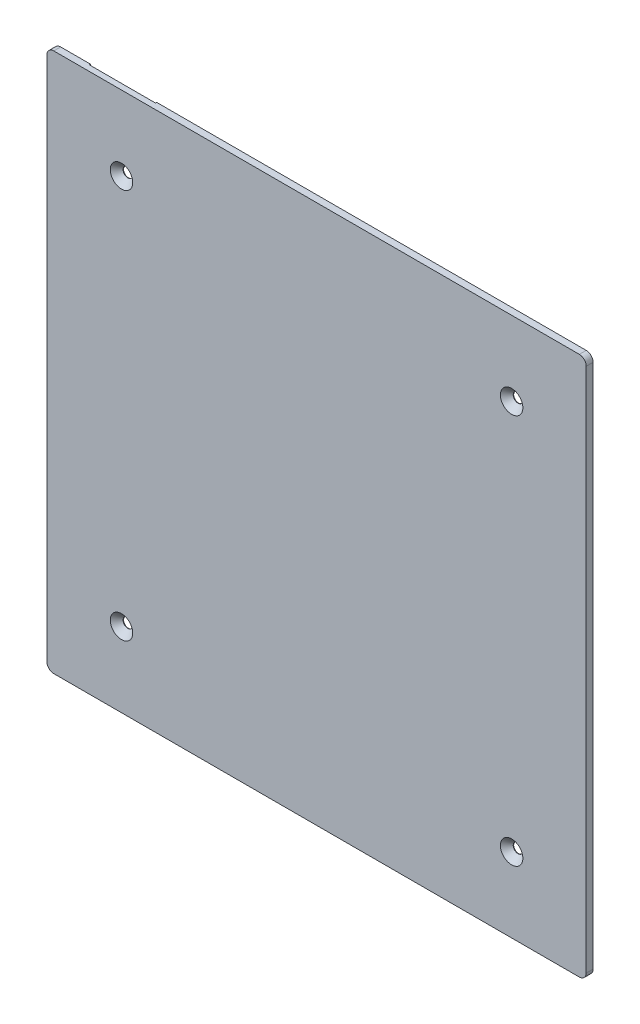
ISO-10303-21;
HEADER;
FILE_DESCRIPTION(('STEP AP214'),'2;1');
FILE_NAME('part.step','',(''),(''),'','','');
FILE_SCHEMA(('AUTOMOTIVE_DESIGN { 1 0 10303 214 1 1 1 1 }'));
ENDSEC;
DATA;
#1=APPLICATION_CONTEXT('core data for automotive mechanical design processes');
#2=APPLICATION_PROTOCOL_DEFINITION('international standard','automotive_design',2000,#1);
#3=PRODUCT_CONTEXT('',#1,'mechanical');
#4=PRODUCT('Part','Part','',(#3));
#5=PRODUCT_RELATED_PRODUCT_CATEGORY('part','',(#4));
#6=PRODUCT_DEFINITION_FORMATION('','',#4);
#7=PRODUCT_DEFINITION_CONTEXT('part definition',#1,'design');
#8=PRODUCT_DEFINITION('design','',#6,#7);
#9=PRODUCT_DEFINITION_SHAPE('','',#8);
#10=(LENGTH_UNIT() NAMED_UNIT(*) SI_UNIT(.MILLI.,.METRE.));
#11=(NAMED_UNIT(*) PLANE_ANGLE_UNIT() SI_UNIT($,.RADIAN.));
#12=(NAMED_UNIT(*) SI_UNIT($,.STERADIAN.) SOLID_ANGLE_UNIT());
#13=UNCERTAINTY_MEASURE_WITH_UNIT(LENGTH_MEASURE(1.E-05),#10,'distance_accuracy_value','');
#14=(GEOMETRIC_REPRESENTATION_CONTEXT(3) GLOBAL_UNCERTAINTY_ASSIGNED_CONTEXT((#13)) GLOBAL_UNIT_ASSIGNED_CONTEXT((#10,
#11,#12)) REPRESENTATION_CONTEXT('',''));
#15=CARTESIAN_POINT('',(0.,0.,0.));
#16=DIRECTION('',(0.,0.,1.));
#17=DIRECTION('',(1.,0.,0.));
#18=AXIS2_PLACEMENT_3D('',#15,#16,#17);
#19=CARTESIAN_POINT('',(117.5,-117.5,3.));
#20=DIRECTION('',(0.,-1.,0.));
#21=DIRECTION('',(0.,0.,-1.));
#22=AXIS2_PLACEMENT_3D('',#19,#20,#21);
#23=PLANE('',#22);
#24=DIRECTION('',(-1.,0.,0.));
#25=VECTOR('',#24,1.);
#26=CARTESIAN_POINT('',(117.5,-117.5,3.));
#27=LINE('',#26,#25);
#28=CARTESIAN_POINT('',(114.5,-117.5,3.));
#29=VERTEX_POINT('',#28);
#30=CARTESIAN_POINT('',(-114.5,-117.5,3.));
#31=VERTEX_POINT('',#30);
#32=EDGE_CURVE('E157',#29,#31,#27,.T.);
#33=ORIENTED_EDGE('',*,*,#32,.T.);
#34=DIRECTION('',(0.,0.,-1.));
#35=VECTOR('',#34,1.);
#36=CARTESIAN_POINT('',(-114.5,-117.5,3.));
#37=LINE('',#36,#35);
#38=CARTESIAN_POINT('',(-114.5,-117.5,0.));
#39=VERTEX_POINT('',#38);
#40=EDGE_CURVE('E182',#31,#39,#37,.T.);
#41=ORIENTED_EDGE('',*,*,#40,.T.);
#42=DIRECTION('',(-1.,0.,0.));
#43=VECTOR('',#42,1.);
#44=CARTESIAN_POINT('',(117.5,-117.5,0.));
#45=LINE('',#44,#43);
#46=CARTESIAN_POINT('',(114.5,-117.5,0.));
#47=VERTEX_POINT('',#46);
#48=EDGE_CURVE('E170',#47,#39,#45,.T.);
#49=ORIENTED_EDGE('',*,*,#48,.F.);
#50=DIRECTION('',(0.,0.,-1.));
#51=VECTOR('',#50,1.);
#52=CARTESIAN_POINT('',(114.5,-117.5,3.));
#53=LINE('',#52,#51);
#54=EDGE_CURVE('E169',#47,#29,#53,.F.);
#55=ORIENTED_EDGE('',*,*,#54,.T.);
#56=EDGE_LOOP('',(#33,#41,#49,#55));
#57=FACE_BOUND('',#56,.T.);
#58=ADVANCED_FACE('F36',(#57),#23,.T.);
#59=CARTESIAN_POINT('',(117.5,117.5,3.));
#60=DIRECTION('',(1.,0.,0.));
#61=DIRECTION('',(0.,1.,0.));
#62=AXIS2_PLACEMENT_3D('',#59,#60,#61);
#63=PLANE('',#62);
#64=DIRECTION('',(0.,-1.,0.));
#65=VECTOR('',#64,1.);
#66=CARTESIAN_POINT('',(117.5,117.5,3.));
#67=LINE('',#66,#65);
#68=CARTESIAN_POINT('',(117.5,114.5,3.));
#69=VERTEX_POINT('',#68);
#70=CARTESIAN_POINT('',(117.5,-114.5,3.));
#71=VERTEX_POINT('',#70);
#72=EDGE_CURVE('E166',#69,#71,#67,.T.);
#73=ORIENTED_EDGE('',*,*,#72,.T.);
#74=DIRECTION('',(0.,0.,-1.));
#75=VECTOR('',#74,1.);
#76=CARTESIAN_POINT('',(117.5,-114.5,3.));
#77=LINE('',#76,#75);
#78=CARTESIAN_POINT('',(117.5,-114.5,0.));
#79=VERTEX_POINT('',#78);
#80=EDGE_CURVE('E207',#71,#79,#77,.T.);
#81=ORIENTED_EDGE('',*,*,#80,.T.);
#82=DIRECTION('',(0.,-1.,0.));
#83=VECTOR('',#82,1.);
#84=CARTESIAN_POINT('',(117.5,117.5,0.));
#85=LINE('',#84,#83);
#86=CARTESIAN_POINT('',(117.5,114.5,0.));
#87=VERTEX_POINT('',#86);
#88=EDGE_CURVE('E161',#87,#79,#85,.T.);
#89=ORIENTED_EDGE('',*,*,#88,.F.);
#90=DIRECTION('',(0.,0.,-1.));
#91=VECTOR('',#90,1.);
#92=CARTESIAN_POINT('',(117.5,114.5,3.));
#93=LINE('',#92,#91);
#94=EDGE_CURVE('E205',#87,#69,#93,.F.);
#95=ORIENTED_EDGE('',*,*,#94,.T.);
#96=EDGE_LOOP('',(#73,#81,#89,#95));
#97=FACE_BOUND('',#96,.T.);
#98=ADVANCED_FACE('F256',(#97),#63,.T.);
#99=CARTESIAN_POINT('',(-117.5,117.5,3.));
#100=DIRECTION('',(0.,1.,0.));
#101=DIRECTION('',(0.,0.,1.));
#102=AXIS2_PLACEMENT_3D('',#99,#100,#101);
#103=PLANE('',#102);
#104=DIRECTION('',(1.,0.,0.));
#105=VECTOR('',#104,1.);
#106=CARTESIAN_POINT('',(-117.5,117.5,0.));
#107=LINE('',#106,#105);
#108=CARTESIAN_POINT('',(-114.5,117.5,0.));
#109=VERTEX_POINT('',#108);
#110=CARTESIAN_POINT('',(-101.46292574176,117.5,0.));
#111=VERTEX_POINT('',#110);
#112=EDGE_CURVE('E177',#109,#111,#107,.T.);
#113=ORIENTED_EDGE('',*,*,#112,.F.);
#114=DIRECTION('',(0.,0.,-1.));
#115=VECTOR('',#114,1.);
#116=CARTESIAN_POINT('',(-114.5,117.5,3.));
#117=LINE('',#116,#115);
#118=CARTESIAN_POINT('',(-114.5,117.5,3.));
#119=VERTEX_POINT('',#118);
#120=EDGE_CURVE('E11',#109,#119,#117,.F.);
#121=ORIENTED_EDGE('',*,*,#120,.T.);
#122=DIRECTION('',(1.,0.,0.));
#123=VECTOR('',#122,1.);
#124=CARTESIAN_POINT('',(-117.5,117.5,3.));
#125=LINE('',#124,#123);
#126=CARTESIAN_POINT('',(114.5,117.5,3.));
#127=VERTEX_POINT('',#126);
#128=EDGE_CURVE('E164',#119,#127,#125,.T.);
#129=ORIENTED_EDGE('',*,*,#128,.T.);
#130=DIRECTION('',(0.,0.,-1.));
#131=VECTOR('',#130,1.);
#132=CARTESIAN_POINT('',(114.5,117.5,3.));
#133=LINE('',#132,#131);
#134=CARTESIAN_POINT('',(114.5,117.5,0.));
#135=VERTEX_POINT('',#134);
#136=EDGE_CURVE('E44',#127,#135,#133,.T.);
#137=ORIENTED_EDGE('',*,*,#136,.T.);
#138=CARTESIAN_POINT('',(-72.6507614869108,117.5,0.));
#139=VERTEX_POINT('',#138);
#140=EDGE_CURVE('E150',#139,#135,#107,.T.);
#141=ORIENTED_EDGE('',*,*,#140,.F.);
#142=DIRECTION('',(0.,0.,-1.));
#143=VECTOR('',#142,1.);
#144=CARTESIAN_POINT('',(-72.6507614869108,117.5,0.5));
#145=LINE('',#144,#143);
#146=CARTESIAN_POINT('',(-72.6507614869108,117.5,0.5));
#147=VERTEX_POINT('',#146);
#148=EDGE_CURVE('E129',#147,#139,#145,.T.);
#149=ORIENTED_EDGE('',*,*,#148,.F.);
#150=DIRECTION('',(1.,0.,0.));
#151=VECTOR('',#150,1.);
#152=CARTESIAN_POINT('',(-101.46292574176,117.5,0.5));
#153=LINE('',#152,#151);
#154=CARTESIAN_POINT('',(-101.46292574176,117.5,0.5));
#155=VERTEX_POINT('',#154);
#156=EDGE_CURVE('E136',#155,#147,#153,.T.);
#157=ORIENTED_EDGE('',*,*,#156,.F.);
#158=DIRECTION('',(0.,0.,-1.));
#159=VECTOR('',#158,1.);
#160=CARTESIAN_POINT('',(-101.46292574176,117.5,0.5));
#161=LINE('',#160,#159);
#162=EDGE_CURVE('E174',#155,#111,#161,.T.);
#163=ORIENTED_EDGE('',*,*,#162,.T.);
#164=EDGE_LOOP('',(#113,#121,#129,#137,#141,#149,#157,#163));
#165=FACE_BOUND('',#164,.T.);
#166=ADVANCED_FACE('F147',(#165),#103,.T.);
#167=CARTESIAN_POINT('',(-117.5,-117.5,3.));
#168=DIRECTION('',(-1.,0.,0.));
#169=DIRECTION('',(0.,0.,1.));
#170=AXIS2_PLACEMENT_3D('',#167,#168,#169);
#171=PLANE('',#170);
#172=DIRECTION('',(0.,1.,0.));
#173=VECTOR('',#172,1.);
#174=CARTESIAN_POINT('',(-117.5,-117.5,0.));
#175=LINE('',#174,#173);
#176=CARTESIAN_POINT('',(-117.5,-114.5,0.));
#177=VERTEX_POINT('',#176);
#178=CARTESIAN_POINT('',(-117.5,114.5,0.));
#179=VERTEX_POINT('',#178);
#180=EDGE_CURVE('E173',#177,#179,#175,.T.);
#181=ORIENTED_EDGE('',*,*,#180,.F.);
#182=DIRECTION('',(0.,0.,-1.));
#183=VECTOR('',#182,1.);
#184=CARTESIAN_POINT('',(-117.5,-114.5,3.));
#185=LINE('',#184,#183);
#186=CARTESIAN_POINT('',(-117.5,-114.5,3.));
#187=VERTEX_POINT('',#186);
#188=EDGE_CURVE('E196',#177,#187,#185,.F.);
#189=ORIENTED_EDGE('',*,*,#188,.T.);
#190=DIRECTION('',(0.,1.,0.));
#191=VECTOR('',#190,1.);
#192=CARTESIAN_POINT('',(-117.5,-117.5,3.));
#193=LINE('',#192,#191);
#194=CARTESIAN_POINT('',(-117.5,114.5,3.));
#195=VERTEX_POINT('',#194);
#196=EDGE_CURVE('E160',#187,#195,#193,.T.);
#197=ORIENTED_EDGE('',*,*,#196,.T.);
#198=DIRECTION('',(0.,0.,-1.));
#199=VECTOR('',#198,1.);
#200=CARTESIAN_POINT('',(-117.5,114.5,3.));
#201=LINE('',#200,#199);
#202=EDGE_CURVE('E193',#195,#179,#201,.T.);
#203=ORIENTED_EDGE('',*,*,#202,.T.);
#204=EDGE_LOOP('',(#181,#189,#197,#203));
#205=FACE_BOUND('',#204,.T.);
#206=ADVANCED_FACE('F242',(#205),#171,.T.);
#207=CARTESIAN_POINT('',(0.,0.,3.));
#208=DIRECTION('',(0.,0.,-1.));
#209=DIRECTION('',(-1.,0.,0.));
#210=AXIS2_PLACEMENT_3D('',#207,#208,#209);
#211=PLANE('',#210);
#212=CARTESIAN_POINT('',(-85.,-85.,3.));
#213=DIRECTION('',(0.,0.,1.));
#214=DIRECTION('',(1.,0.,0.));
#215=AXIS2_PLACEMENT_3D('',#212,#213,#214);
#216=CIRCLE('',#215,4.90000000002055);
#217=CARTESIAN_POINT('',(-80.0999999999794,-85.,3.));
#218=VERTEX_POINT('',#217);
#219=EDGE_CURVE('E453',#218,#218,#216,.T.);
#220=ORIENTED_EDGE('',*,*,#219,.F.);
#221=EDGE_LOOP('',(#220));
#222=FACE_BOUND('',#221,.T.);
#223=CARTESIAN_POINT('',(85.,-85.,3.));
#224=DIRECTION('',(0.,0.,1.));
#225=DIRECTION('',(1.,0.,0.));
#226=AXIS2_PLACEMENT_3D('',#223,#224,#225);
#227=CIRCLE('',#226,4.90000000002055);
#228=CARTESIAN_POINT('',(89.9000000000206,-85.,3.));
#229=VERTEX_POINT('',#228);
#230=EDGE_CURVE('E457',#229,#229,#227,.T.);
#231=ORIENTED_EDGE('',*,*,#230,.F.);
#232=EDGE_LOOP('',(#231));
#233=FACE_BOUND('',#232,.T.);
#234=CARTESIAN_POINT('',(85.,85.,3.));
#235=DIRECTION('',(0.,0.,1.));
#236=DIRECTION('',(1.,0.,0.));
#237=AXIS2_PLACEMENT_3D('',#234,#235,#236);
#238=CIRCLE('',#237,4.90000000002055);
#239=CARTESIAN_POINT('',(89.9000000000206,85.,3.));
#240=VERTEX_POINT('',#239);
#241=EDGE_CURVE('E461',#240,#240,#238,.T.);
#242=ORIENTED_EDGE('',*,*,#241,.F.);
#243=EDGE_LOOP('',(#242));
#244=FACE_BOUND('',#243,.T.);
#245=CARTESIAN_POINT('',(-85.,85.,3.));
#246=DIRECTION('',(0.,0.,1.));
#247=DIRECTION('',(1.,0.,0.));
#248=AXIS2_PLACEMENT_3D('',#245,#246,#247);
#249=CIRCLE('',#248,4.90000000002055);
#250=CARTESIAN_POINT('',(-80.0999999999794,85.,3.));
#251=VERTEX_POINT('',#250);
#252=EDGE_CURVE('E464',#251,#251,#249,.T.);
#253=ORIENTED_EDGE('',*,*,#252,.F.);
#254=EDGE_LOOP('',(#253));
#255=FACE_BOUND('',#254,.T.);
#256=ORIENTED_EDGE('',*,*,#196,.F.);
#257=CARTESIAN_POINT('',(-114.5,-114.5,3.));
#258=DIRECTION('',(0.,0.,-1.));
#259=DIRECTION('',(-1.,0.,0.));
#260=AXIS2_PLACEMENT_3D('',#257,#258,#259);
#261=CIRCLE('',#260,3.);
#262=EDGE_CURVE('E203',#187,#31,#261,.F.);
#263=ORIENTED_EDGE('',*,*,#262,.T.);
#264=ORIENTED_EDGE('',*,*,#32,.F.);
#265=CARTESIAN_POINT('',(114.5,-114.5,3.));
#266=DIRECTION('',(0.,0.,-1.));
#267=DIRECTION('',(-1.,0.,0.));
#268=AXIS2_PLACEMENT_3D('',#265,#266,#267);
#269=CIRCLE('',#268,3.);
#270=EDGE_CURVE('E201',#29,#71,#269,.F.);
#271=ORIENTED_EDGE('',*,*,#270,.T.);
#272=ORIENTED_EDGE('',*,*,#72,.F.);
#273=CARTESIAN_POINT('',(114.5,114.5,3.));
#274=DIRECTION('',(0.,0.,-1.));
#275=DIRECTION('',(-1.,0.,0.));
#276=AXIS2_PLACEMENT_3D('',#273,#274,#275);
#277=CIRCLE('',#276,3.);
#278=EDGE_CURVE('E51',#69,#127,#277,.F.);
#279=ORIENTED_EDGE('',*,*,#278,.T.);
#280=ORIENTED_EDGE('',*,*,#128,.F.);
#281=CARTESIAN_POINT('',(-114.5,114.5,3.));
#282=DIRECTION('',(0.,0.,-1.));
#283=DIRECTION('',(-1.,0.,0.));
#284=AXIS2_PLACEMENT_3D('',#281,#282,#283);
#285=CIRCLE('',#284,3.);
#286=EDGE_CURVE('E199',#119,#195,#285,.F.);
#287=ORIENTED_EDGE('',*,*,#286,.T.);
#288=EDGE_LOOP('',(#256,#263,#264,#271,#272,#279,#280,#287));
#289=FACE_BOUND('',#288,.T.);
#290=ADVANCED_FACE('F238',(#222,#233,#244,#255,#289),#211,.F.);
#291=CARTESIAN_POINT('',(0.,0.,0.));
#292=DIRECTION('',(0.,0.,-1.));
#293=DIRECTION('',(-1.,0.,0.));
#294=AXIS2_PLACEMENT_3D('',#291,#292,#293);
#295=PLANE('',#294);
#296=CARTESIAN_POINT('',(-85.,-85.,0.));
#297=DIRECTION('',(0.,0.,1.));
#298=DIRECTION('',(1.,0.,0.));
#299=AXIS2_PLACEMENT_3D('',#296,#297,#298);
#300=CIRCLE('',#299,2.09999999994805);
#301=CARTESIAN_POINT('',(-82.9000000000519,-85.,0.));
#302=VERTEX_POINT('',#301);
#303=EDGE_CURVE('E484',#302,#302,#300,.T.);
#304=ORIENTED_EDGE('',*,*,#303,.T.);
#305=EDGE_LOOP('',(#304));
#306=FACE_BOUND('',#305,.T.);
#307=CARTESIAN_POINT('',(85.,-85.,0.));
#308=DIRECTION('',(0.,0.,1.));
#309=DIRECTION('',(1.,0.,0.));
#310=AXIS2_PLACEMENT_3D('',#307,#308,#309);
#311=CIRCLE('',#310,2.09999999994805);
#312=CARTESIAN_POINT('',(87.0999999999481,-85.,0.));
#313=VERTEX_POINT('',#312);
#314=EDGE_CURVE('E477',#313,#313,#311,.T.);
#315=ORIENTED_EDGE('',*,*,#314,.T.);
#316=EDGE_LOOP('',(#315));
#317=FACE_BOUND('',#316,.T.);
#318=CARTESIAN_POINT('',(85.,85.,0.));
#319=DIRECTION('',(0.,0.,1.));
#320=DIRECTION('',(1.,0.,0.));
#321=AXIS2_PLACEMENT_3D('',#318,#319,#320);
#322=CIRCLE('',#321,2.09999999994805);
#323=CARTESIAN_POINT('',(87.0999999999481,85.,0.));
#324=VERTEX_POINT('',#323);
#325=EDGE_CURVE('E466',#324,#324,#322,.T.);
#326=ORIENTED_EDGE('',*,*,#325,.T.);
#327=EDGE_LOOP('',(#326));
#328=FACE_BOUND('',#327,.T.);
#329=CARTESIAN_POINT('',(-85.,85.,0.));
#330=DIRECTION('',(0.,0.,1.));
#331=DIRECTION('',(1.,0.,0.));
#332=AXIS2_PLACEMENT_3D('',#329,#330,#331);
#333=CIRCLE('',#332,2.09999999994805);
#334=CARTESIAN_POINT('',(-82.9000000000519,85.,0.));
#335=VERTEX_POINT('',#334);
#336=EDGE_CURVE('E219',#335,#335,#333,.T.);
#337=ORIENTED_EDGE('',*,*,#336,.T.);
#338=EDGE_LOOP('',(#337));
#339=FACE_BOUND('',#338,.T.);
#340=ORIENTED_EDGE('',*,*,#48,.T.);
#341=CARTESIAN_POINT('',(-114.5,-114.5,0.));
#342=DIRECTION('',(0.,0.,-1.));
#343=DIRECTION('',(-1.,0.,0.));
#344=AXIS2_PLACEMENT_3D('',#341,#342,#343);
#345=CIRCLE('',#344,3.);
#346=EDGE_CURVE('E191',#39,#177,#345,.T.);
#347=ORIENTED_EDGE('',*,*,#346,.T.);
#348=ORIENTED_EDGE('',*,*,#180,.T.);
#349=CARTESIAN_POINT('',(-114.5,114.5,0.));
#350=DIRECTION('',(0.,0.,-1.));
#351=DIRECTION('',(-1.,0.,0.));
#352=AXIS2_PLACEMENT_3D('',#349,#350,#351);
#353=CIRCLE('',#352,3.);
#354=EDGE_CURVE('E187',#179,#109,#353,.T.);
#355=ORIENTED_EDGE('',*,*,#354,.T.);
#356=ORIENTED_EDGE('',*,*,#112,.T.);
#357=DIRECTION('',(0.,1.,0.));
#358=VECTOR('',#357,1.);
#359=CARTESIAN_POINT('',(-101.46292574176,106.050790199477,0.));
#360=LINE('',#359,#358);
#361=CARTESIAN_POINT('',(-101.46292574176,106.050790199477,0.));
#362=VERTEX_POINT('',#361);
#363=EDGE_CURVE('E144',#362,#111,#360,.T.);
#364=ORIENTED_EDGE('',*,*,#363,.F.);
#365=DIRECTION('',(-1.,0.,0.));
#366=VECTOR('',#365,1.);
#367=CARTESIAN_POINT('',(-72.6507614869108,106.050790199477,0.));
#368=LINE('',#367,#366);
#369=CARTESIAN_POINT('',(-72.6507614869108,106.050790199477,0.));
#370=VERTEX_POINT('',#369);
#371=EDGE_CURVE('E218',#370,#362,#368,.T.);
#372=ORIENTED_EDGE('',*,*,#371,.F.);
#373=DIRECTION('',(0.,-1.,0.));
#374=VECTOR('',#373,1.);
#375=CARTESIAN_POINT('',(-72.6507614869108,117.5,0.));
#376=LINE('',#375,#374);
#377=EDGE_CURVE('E215',#139,#370,#376,.T.);
#378=ORIENTED_EDGE('',*,*,#377,.F.);
#379=ORIENTED_EDGE('',*,*,#140,.T.);
#380=CARTESIAN_POINT('',(114.5,114.5,0.));
#381=DIRECTION('',(0.,0.,-1.));
#382=DIRECTION('',(-1.,0.,0.));
#383=AXIS2_PLACEMENT_3D('',#380,#381,#382);
#384=CIRCLE('',#383,3.);
#385=EDGE_CURVE('E185',#135,#87,#384,.T.);
#386=ORIENTED_EDGE('',*,*,#385,.T.);
#387=ORIENTED_EDGE('',*,*,#88,.T.);
#388=CARTESIAN_POINT('',(114.5,-114.5,0.));
#389=DIRECTION('',(0.,0.,-1.));
#390=DIRECTION('',(-1.,0.,0.));
#391=AXIS2_PLACEMENT_3D('',#388,#389,#390);
#392=CIRCLE('',#391,3.);
#393=EDGE_CURVE('E189',#79,#47,#392,.T.);
#394=ORIENTED_EDGE('',*,*,#393,.T.);
#395=EDGE_LOOP('',(#340,#347,#348,#355,#356,#364,#372,#378,#379,#386,#387,#394));
#396=FACE_BOUND('',#395,.T.);
#397=ADVANCED_FACE('F212',(#306,#317,#328,#339,#396),#295,.T.);
#398=CARTESIAN_POINT('',(-101.46292574176,106.050790199477,0.5));
#399=DIRECTION('',(-1.,0.,0.));
#400=DIRECTION('',(0.,0.,1.));
#401=AXIS2_PLACEMENT_3D('',#398,#399,#400);
#402=PLANE('',#401);
#403=ORIENTED_EDGE('',*,*,#363,.T.);
#404=ORIENTED_EDGE('',*,*,#162,.F.);
#405=DIRECTION('',(0.,1.,0.));
#406=VECTOR('',#405,1.);
#407=CARTESIAN_POINT('',(-101.46292574176,106.050790199477,0.5));
#408=LINE('',#407,#406);
#409=CARTESIAN_POINT('',(-101.46292574176,106.050790199477,0.5));
#410=VERTEX_POINT('',#409);
#411=EDGE_CURVE('E142',#410,#155,#408,.T.);
#412=ORIENTED_EDGE('',*,*,#411,.F.);
#413=DIRECTION('',(0.,0.,-1.));
#414=VECTOR('',#413,1.);
#415=CARTESIAN_POINT('',(-101.46292574176,106.050790199477,0.5));
#416=LINE('',#415,#414);
#417=EDGE_CURVE('E152',#410,#362,#416,.T.);
#418=ORIENTED_EDGE('',*,*,#417,.T.);
#419=EDGE_LOOP('',(#403,#404,#412,#418));
#420=FACE_BOUND('',#419,.T.);
#421=ADVANCED_FACE('F230',(#420),#402,.F.);
#422=CARTESIAN_POINT('',(-72.6507614869108,106.050790199477,0.5));
#423=DIRECTION('',(0.,-1.,0.));
#424=DIRECTION('',(0.,0.,-1.));
#425=AXIS2_PLACEMENT_3D('',#422,#423,#424);
#426=PLANE('',#425);
#427=ORIENTED_EDGE('',*,*,#371,.T.);
#428=ORIENTED_EDGE('',*,*,#417,.F.);
#429=DIRECTION('',(-1.,0.,0.));
#430=VECTOR('',#429,1.);
#431=CARTESIAN_POINT('',(-72.6507614869108,106.050790199477,0.5));
#432=LINE('',#431,#430);
#433=CARTESIAN_POINT('',(-72.6507614869108,106.050790199477,0.5));
#434=VERTEX_POINT('',#433);
#435=EDGE_CURVE('E135',#434,#410,#432,.T.);
#436=ORIENTED_EDGE('',*,*,#435,.F.);
#437=DIRECTION('',(0.,0.,-1.));
#438=VECTOR('',#437,1.);
#439=CARTESIAN_POINT('',(-72.6507614869108,106.050790199477,0.5));
#440=LINE('',#439,#438);
#441=EDGE_CURVE('E131',#434,#370,#440,.T.);
#442=ORIENTED_EDGE('',*,*,#441,.T.);
#443=EDGE_LOOP('',(#427,#428,#436,#442));
#444=FACE_BOUND('',#443,.T.);
#445=ADVANCED_FACE('F232',(#444),#426,.F.);
#446=CARTESIAN_POINT('',(-72.6507614869108,117.5,0.5));
#447=DIRECTION('',(1.,0.,0.));
#448=DIRECTION('',(0.,0.,-1.));
#449=AXIS2_PLACEMENT_3D('',#446,#447,#448);
#450=PLANE('',#449);
#451=ORIENTED_EDGE('',*,*,#377,.T.);
#452=ORIENTED_EDGE('',*,*,#441,.F.);
#453=DIRECTION('',(0.,-1.,0.));
#454=VECTOR('',#453,1.);
#455=CARTESIAN_POINT('',(-72.6507614869108,117.5,0.5));
#456=LINE('',#455,#454);
#457=EDGE_CURVE('E124',#147,#434,#456,.T.);
#458=ORIENTED_EDGE('',*,*,#457,.F.);
#459=ORIENTED_EDGE('',*,*,#148,.T.);
#460=EDGE_LOOP('',(#451,#452,#458,#459));
#461=FACE_BOUND('',#460,.T.);
#462=ADVANCED_FACE('F127',(#461),#450,.F.);
#463=CARTESIAN_POINT('',(0.,0.,0.5));
#464=DIRECTION('',(0.,0.,-1.));
#465=DIRECTION('',(-1.,0.,0.));
#466=AXIS2_PLACEMENT_3D('',#463,#464,#465);
#467=PLANE('',#466);
#468=ORIENTED_EDGE('',*,*,#156,.T.);
#469=ORIENTED_EDGE('',*,*,#457,.T.);
#470=ORIENTED_EDGE('',*,*,#435,.T.);
#471=ORIENTED_EDGE('',*,*,#411,.T.);
#472=EDGE_LOOP('',(#468,#469,#470,#471));
#473=FACE_BOUND('',#472,.T.);
#474=ADVANCED_FACE('F140',(#473),#467,.T.);
#475=CARTESIAN_POINT('',(-85.,85.,3.));
#476=DIRECTION('',(0.,0.,1.));
#477=DIRECTION('',(1.,0.,0.));
#478=AXIS2_PLACEMENT_3D('',#475,#476,#477);
#479=CYLINDRICAL_SURFACE('',#478,2.09999999994805);
#480=ORIENTED_EDGE('',*,*,#336,.F.);
#481=EDGE_LOOP('',(#480));
#482=FACE_BOUND('',#481,.T.);
#483=CARTESIAN_POINT('',(-85.,85.,0.199999999984335));
#484=DIRECTION('',(0.,0.,1.));
#485=DIRECTION('',(1.,0.,0.));
#486=AXIS2_PLACEMENT_3D('',#483,#484,#485);
#487=CIRCLE('',#486,2.09999999994805);
#488=CARTESIAN_POINT('',(-82.9000000000519,85.,0.199999999984335));
#489=VERTEX_POINT('',#488);
#490=EDGE_CURVE('E223',#489,#489,#487,.T.);
#491=ORIENTED_EDGE('',*,*,#490,.T.);
#492=EDGE_LOOP('',(#491));
#493=FACE_BOUND('',#492,.T.);
#494=ADVANCED_FACE('F358',(#482,#493),#479,.F.);
#495=CARTESIAN_POINT('',(-85.,85.,3.));
#496=DIRECTION('',(0.,0.,1.));
#497=DIRECTION('',(1.,0.,0.));
#498=AXIS2_PLACEMENT_3D('',#495,#496,#497);
#499=CONICAL_SURFACE('',#498,4.90000000002055,0.785398163407599);
#500=ORIENTED_EDGE('',*,*,#490,.F.);
#501=EDGE_LOOP('',(#500));
#502=FACE_BOUND('',#501,.T.);
#503=ORIENTED_EDGE('',*,*,#252,.T.);
#504=EDGE_LOOP('',(#503));
#505=FACE_BOUND('',#504,.T.);
#506=ADVANCED_FACE('F349',(#502,#505),#499,.F.);
#507=CARTESIAN_POINT('',(85.,85.,3.));
#508=DIRECTION('',(0.,0.,1.));
#509=DIRECTION('',(1.,0.,0.));
#510=AXIS2_PLACEMENT_3D('',#507,#508,#509);
#511=CYLINDRICAL_SURFACE('',#510,2.09999999994805);
#512=ORIENTED_EDGE('',*,*,#325,.F.);
#513=EDGE_LOOP('',(#512));
#514=FACE_BOUND('',#513,.T.);
#515=CARTESIAN_POINT('',(85.,85.,0.199999999984335));
#516=DIRECTION('',(0.,0.,1.));
#517=DIRECTION('',(1.,0.,0.));
#518=AXIS2_PLACEMENT_3D('',#515,#516,#517);
#519=CIRCLE('',#518,2.09999999994805);
#520=CARTESIAN_POINT('',(87.0999999999481,85.,0.199999999984335));
#521=VERTEX_POINT('',#520);
#522=EDGE_CURVE('E471',#521,#521,#519,.T.);
#523=ORIENTED_EDGE('',*,*,#522,.T.);
#524=EDGE_LOOP('',(#523));
#525=FACE_BOUND('',#524,.T.);
#526=ADVANCED_FACE('F340',(#514,#525),#511,.F.);
#527=CARTESIAN_POINT('',(85.,85.,3.));
#528=DIRECTION('',(0.,0.,1.));
#529=DIRECTION('',(1.,0.,0.));
#530=AXIS2_PLACEMENT_3D('',#527,#528,#529);
#531=CONICAL_SURFACE('',#530,4.90000000002055,0.785398163407599);
#532=ORIENTED_EDGE('',*,*,#522,.F.);
#533=EDGE_LOOP('',(#532));
#534=FACE_BOUND('',#533,.T.);
#535=ORIENTED_EDGE('',*,*,#241,.T.);
#536=EDGE_LOOP('',(#535));
#537=FACE_BOUND('',#536,.T.);
#538=ADVANCED_FACE('F331',(#534,#537),#531,.F.);
#539=CARTESIAN_POINT('',(85.,-85.,3.));
#540=DIRECTION('',(0.,0.,1.));
#541=DIRECTION('',(1.,0.,0.));
#542=AXIS2_PLACEMENT_3D('',#539,#540,#541);
#543=CYLINDRICAL_SURFACE('',#542,2.09999999994805);
#544=ORIENTED_EDGE('',*,*,#314,.F.);
#545=EDGE_LOOP('',(#544));
#546=FACE_BOUND('',#545,.T.);
#547=CARTESIAN_POINT('',(85.,-85.,0.199999999984335));
#548=DIRECTION('',(0.,0.,1.));
#549=DIRECTION('',(1.,0.,0.));
#550=AXIS2_PLACEMENT_3D('',#547,#548,#549);
#551=CIRCLE('',#550,2.09999999994805);
#552=CARTESIAN_POINT('',(87.0999999999481,-85.,0.199999999984335));
#553=VERTEX_POINT('',#552);
#554=EDGE_CURVE('E480',#553,#553,#551,.T.);
#555=ORIENTED_EDGE('',*,*,#554,.T.);
#556=EDGE_LOOP('',(#555));
#557=FACE_BOUND('',#556,.T.);
#558=ADVANCED_FACE('F322',(#546,#557),#543,.F.);
#559=CARTESIAN_POINT('',(85.,-85.,3.));
#560=DIRECTION('',(0.,0.,1.));
#561=DIRECTION('',(1.,0.,0.));
#562=AXIS2_PLACEMENT_3D('',#559,#560,#561);
#563=CONICAL_SURFACE('',#562,4.90000000002055,0.785398163407599);
#564=ORIENTED_EDGE('',*,*,#554,.F.);
#565=EDGE_LOOP('',(#564));
#566=FACE_BOUND('',#565,.T.);
#567=ORIENTED_EDGE('',*,*,#230,.T.);
#568=EDGE_LOOP('',(#567));
#569=FACE_BOUND('',#568,.T.);
#570=ADVANCED_FACE('F313',(#566,#569),#563,.F.);
#571=CARTESIAN_POINT('',(-85.,-85.,3.));
#572=DIRECTION('',(0.,0.,1.));
#573=DIRECTION('',(1.,0.,0.));
#574=AXIS2_PLACEMENT_3D('',#571,#572,#573);
#575=CYLINDRICAL_SURFACE('',#574,2.09999999994805);
#576=ORIENTED_EDGE('',*,*,#303,.F.);
#577=EDGE_LOOP('',(#576));
#578=FACE_BOUND('',#577,.T.);
#579=CARTESIAN_POINT('',(-85.,-85.,0.199999999984335));
#580=DIRECTION('',(0.,0.,1.));
#581=DIRECTION('',(1.,0.,0.));
#582=AXIS2_PLACEMENT_3D('',#579,#580,#581);
#583=CIRCLE('',#582,2.09999999994805);
#584=CARTESIAN_POINT('',(-82.9000000000519,-85.,0.199999999984335));
#585=VERTEX_POINT('',#584);
#586=EDGE_CURVE('E487',#585,#585,#583,.T.);
#587=ORIENTED_EDGE('',*,*,#586,.T.);
#588=EDGE_LOOP('',(#587));
#589=FACE_BOUND('',#588,.T.);
#590=ADVANCED_FACE('F304',(#578,#589),#575,.F.);
#591=CARTESIAN_POINT('',(-85.,-85.,3.));
#592=DIRECTION('',(0.,0.,1.));
#593=DIRECTION('',(1.,0.,0.));
#594=AXIS2_PLACEMENT_3D('',#591,#592,#593);
#595=CONICAL_SURFACE('',#594,4.90000000002055,0.785398163407599);
#596=ORIENTED_EDGE('',*,*,#586,.F.);
#597=EDGE_LOOP('',(#596));
#598=FACE_BOUND('',#597,.T.);
#599=ORIENTED_EDGE('',*,*,#219,.T.);
#600=EDGE_LOOP('',(#599));
#601=FACE_BOUND('',#600,.T.);
#602=ADVANCED_FACE('F273',(#598,#601),#595,.F.);
#603=CARTESIAN_POINT('',(-114.5,-114.5,3.));
#604=DIRECTION('',(0.,0.,-1.));
#605=DIRECTION('',(-1.,0.,0.));
#606=AXIS2_PLACEMENT_3D('',#603,#604,#605);
#607=CYLINDRICAL_SURFACE('',#606,3.);
#608=ORIENTED_EDGE('',*,*,#262,.F.);
#609=ORIENTED_EDGE('',*,*,#188,.F.);
#610=ORIENTED_EDGE('',*,*,#346,.F.);
#611=ORIENTED_EDGE('',*,*,#40,.F.);
#612=EDGE_LOOP('',(#608,#609,#610,#611));
#613=FACE_BOUND('',#612,.T.);
#614=ADVANCED_FACE('F245',(#613),#607,.T.);
#615=CARTESIAN_POINT('',(114.5,-114.5,3.));
#616=DIRECTION('',(0.,0.,-1.));
#617=DIRECTION('',(-1.,0.,0.));
#618=AXIS2_PLACEMENT_3D('',#615,#616,#617);
#619=CYLINDRICAL_SURFACE('',#618,3.);
#620=ORIENTED_EDGE('',*,*,#270,.F.);
#621=ORIENTED_EDGE('',*,*,#54,.F.);
#622=ORIENTED_EDGE('',*,*,#393,.F.);
#623=ORIENTED_EDGE('',*,*,#80,.F.);
#624=EDGE_LOOP('',(#620,#621,#622,#623));
#625=FACE_BOUND('',#624,.T.);
#626=ADVANCED_FACE('F253',(#625),#619,.T.);
#627=CARTESIAN_POINT('',(-114.5,114.5,3.));
#628=DIRECTION('',(0.,0.,-1.));
#629=DIRECTION('',(-1.,0.,0.));
#630=AXIS2_PLACEMENT_3D('',#627,#628,#629);
#631=CYLINDRICAL_SURFACE('',#630,3.);
#632=ORIENTED_EDGE('',*,*,#286,.F.);
#633=ORIENTED_EDGE('',*,*,#120,.F.);
#634=ORIENTED_EDGE('',*,*,#354,.F.);
#635=ORIENTED_EDGE('',*,*,#202,.F.);
#636=EDGE_LOOP('',(#632,#633,#634,#635));
#637=FACE_BOUND('',#636,.T.);
#638=ADVANCED_FACE('F235',(#637),#631,.T.);
#639=CARTESIAN_POINT('',(114.5,114.5,3.));
#640=DIRECTION('',(0.,0.,-1.));
#641=DIRECTION('',(-1.,0.,0.));
#642=AXIS2_PLACEMENT_3D('',#639,#640,#641);
#643=CYLINDRICAL_SURFACE('',#642,3.);
#644=ORIENTED_EDGE('',*,*,#278,.F.);
#645=ORIENTED_EDGE('',*,*,#94,.F.);
#646=ORIENTED_EDGE('',*,*,#385,.F.);
#647=ORIENTED_EDGE('',*,*,#136,.F.);
#648=EDGE_LOOP('',(#644,#645,#646,#647));
#649=FACE_BOUND('',#648,.T.);
#650=ADVANCED_FACE('F38',(#649),#643,.T.);
#651=CLOSED_SHELL('',(#58,#98,#166,#206,#290,#397,#421,#445,#462,#474,#494,#506,#526,#538,#558,
#570,#590,#602,#614,#626,#638,#650));
#652=MANIFOLD_SOLID_BREP('B2',#651);
#653=ADVANCED_BREP_SHAPE_REPRESENTATION('',(#18,#652),#14);
#654=SHAPE_DEFINITION_REPRESENTATION(#9,#653);
ENDSEC;
END-ISO-10303-21;
